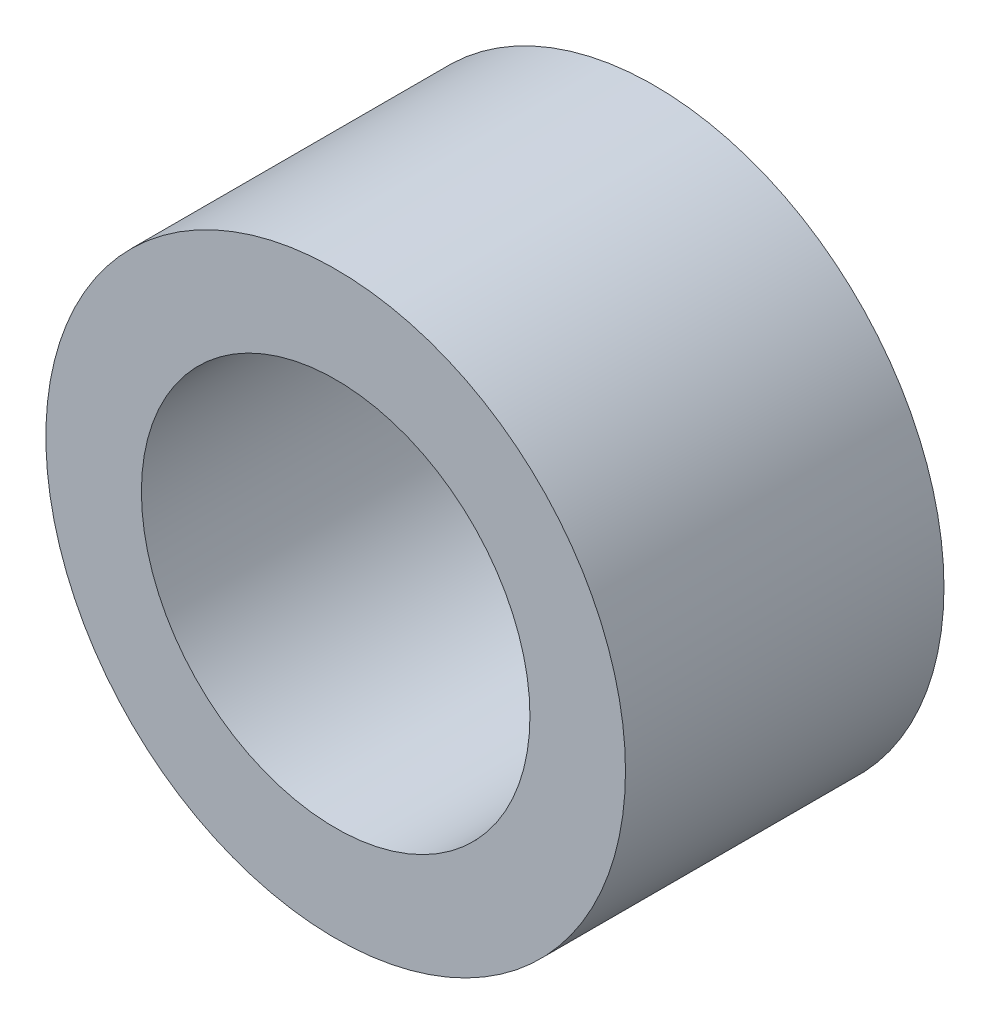
ISO-10303-21;
HEADER;
FILE_DESCRIPTION(('STEP AP214'),'2;1');
FILE_NAME('part.step','',(''),(''),'','','');
FILE_SCHEMA(('AUTOMOTIVE_DESIGN { 1 0 10303 214 1 1 1 1 }'));
ENDSEC;
DATA;
#1=APPLICATION_CONTEXT('core data for automotive mechanical design processes');
#2=APPLICATION_PROTOCOL_DEFINITION('international standard','automotive_design',2000,#1);
#3=PRODUCT_CONTEXT('',#1,'mechanical');
#4=PRODUCT('Part','Part','',(#3));
#5=PRODUCT_RELATED_PRODUCT_CATEGORY('part','',(#4));
#6=PRODUCT_DEFINITION_FORMATION('','',#4);
#7=PRODUCT_DEFINITION_CONTEXT('part definition',#1,'design');
#8=PRODUCT_DEFINITION('design','',#6,#7);
#9=PRODUCT_DEFINITION_SHAPE('','',#8);
#10=(LENGTH_UNIT() NAMED_UNIT(*) SI_UNIT(.MILLI.,.METRE.));
#11=(NAMED_UNIT(*) PLANE_ANGLE_UNIT() SI_UNIT($,.RADIAN.));
#12=(NAMED_UNIT(*) SI_UNIT($,.STERADIAN.) SOLID_ANGLE_UNIT());
#13=UNCERTAINTY_MEASURE_WITH_UNIT(LENGTH_MEASURE(1.E-05),#10,'distance_accuracy_value','');
#14=(GEOMETRIC_REPRESENTATION_CONTEXT(3) GLOBAL_UNCERTAINTY_ASSIGNED_CONTEXT((#13)) GLOBAL_UNIT_ASSIGNED_CONTEXT((#10,
#11,#12)) REPRESENTATION_CONTEXT('',''));
#15=CARTESIAN_POINT('',(0.,0.,0.));
#16=DIRECTION('',(0.,0.,1.));
#17=DIRECTION('',(1.,0.,0.));
#18=AXIS2_PLACEMENT_3D('',#15,#16,#17);
#19=CARTESIAN_POINT('',(0.,0.,10.));
#20=DIRECTION('',(0.,0.,1.));
#21=DIRECTION('',(1.,0.,0.));
#22=AXIS2_PLACEMENT_3D('',#19,#20,#21);
#23=PLANE('',#22);
#24=CARTESIAN_POINT('',(0.,0.,10.));
#25=DIRECTION('',(0.,0.,1.));
#26=DIRECTION('',(1.,0.,0.));
#27=AXIS2_PLACEMENT_3D('',#24,#25,#26);
#28=CIRCLE('',#27,9.1);
#29=CARTESIAN_POINT('',(9.1,0.,10.));
#30=VERTEX_POINT('',#29);
#31=EDGE_CURVE('E10',#30,#30,#28,.T.);
#32=ORIENTED_EDGE('',*,*,#31,.T.);
#33=EDGE_LOOP('',(#32));
#34=FACE_BOUND('',#33,.T.);
#35=CARTESIAN_POINT('',(0.,0.,10.));
#36=DIRECTION('',(0.,0.,1.));
#37=DIRECTION('',(1.,0.,0.));
#38=AXIS2_PLACEMENT_3D('',#35,#36,#37);
#39=CIRCLE('',#38,6.1);
#40=CARTESIAN_POINT('',(6.1,0.,10.));
#41=VERTEX_POINT('',#40);
#42=EDGE_CURVE('E50',#41,#41,#39,.T.);
#43=ORIENTED_EDGE('',*,*,#42,.F.);
#44=EDGE_LOOP('',(#43));
#45=FACE_BOUND('',#44,.T.);
#46=ADVANCED_FACE('F37',(#34,#45),#23,.T.);
#47=CARTESIAN_POINT('',(0.,0.,0.));
#48=DIRECTION('',(0.,0.,1.));
#49=DIRECTION('',(1.,0.,0.));
#50=AXIS2_PLACEMENT_3D('',#47,#48,#49);
#51=PLANE('',#50);
#52=CARTESIAN_POINT('',(0.,0.,0.));
#53=DIRECTION('',(0.,0.,1.));
#54=DIRECTION('',(1.,0.,0.));
#55=AXIS2_PLACEMENT_3D('',#52,#53,#54);
#56=CIRCLE('',#55,9.1);
#57=CARTESIAN_POINT('',(9.1,0.,0.));
#58=VERTEX_POINT('',#57);
#59=EDGE_CURVE('E41',#58,#58,#56,.T.);
#60=ORIENTED_EDGE('',*,*,#59,.F.);
#61=EDGE_LOOP('',(#60));
#62=FACE_BOUND('',#61,.T.);
#63=CARTESIAN_POINT('',(0.,0.,0.));
#64=DIRECTION('',(0.,0.,1.));
#65=DIRECTION('',(1.,0.,0.));
#66=AXIS2_PLACEMENT_3D('',#63,#64,#65);
#67=CIRCLE('',#66,6.1);
#68=CARTESIAN_POINT('',(6.1,0.,0.));
#69=VERTEX_POINT('',#68);
#70=EDGE_CURVE('E52',#69,#69,#67,.T.);
#71=ORIENTED_EDGE('',*,*,#70,.T.);
#72=EDGE_LOOP('',(#71));
#73=FACE_BOUND('',#72,.T.);
#74=ADVANCED_FACE('F64',(#62,#73),#51,.F.);
#75=CARTESIAN_POINT('',(0.,0.,10.));
#76=DIRECTION('',(0.,0.,-1.));
#77=DIRECTION('',(-1.,0.,0.));
#78=AXIS2_PLACEMENT_3D('',#75,#76,#77);
#79=CYLINDRICAL_SURFACE('',#78,9.1);
#80=ORIENTED_EDGE('',*,*,#31,.F.);
#81=EDGE_LOOP('',(#80));
#82=FACE_BOUND('',#81,.T.);
#83=ORIENTED_EDGE('',*,*,#59,.T.);
#84=EDGE_LOOP('',(#83));
#85=FACE_BOUND('',#84,.T.);
#86=ADVANCED_FACE('F39',(#82,#85),#79,.T.);
#87=CARTESIAN_POINT('',(0.,0.,10.));
#88=DIRECTION('',(0.,0.,-1.));
#89=DIRECTION('',(-1.,0.,0.));
#90=AXIS2_PLACEMENT_3D('',#87,#88,#89);
#91=CYLINDRICAL_SURFACE('',#90,6.1);
#92=ORIENTED_EDGE('',*,*,#42,.T.);
#93=EDGE_LOOP('',(#92));
#94=FACE_BOUND('',#93,.T.);
#95=ORIENTED_EDGE('',*,*,#70,.F.);
#96=EDGE_LOOP('',(#95));
#97=FACE_BOUND('',#96,.T.);
#98=ADVANCED_FACE('F60',(#94,#97),#91,.F.);
#99=CLOSED_SHELL('',(#46,#74,#86,#98));
#100=MANIFOLD_SOLID_BREP('B2',#99);
#101=ADVANCED_BREP_SHAPE_REPRESENTATION('',(#18,#100),#14);
#102=SHAPE_DEFINITION_REPRESENTATION(#9,#101);
ENDSEC;
END-ISO-10303-21;
